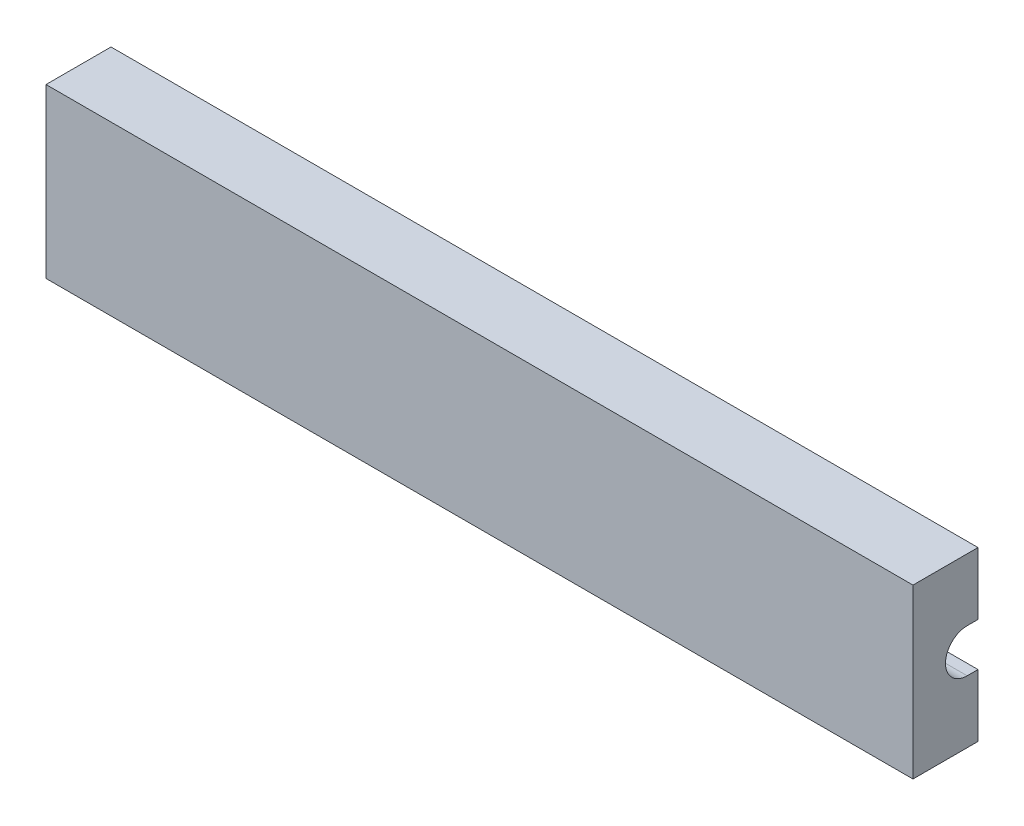
ISO-10303-21;
HEADER;
FILE_DESCRIPTION(('STEP AP214'),'2;1');
FILE_NAME('part.step','',(''),(''),'','','');
FILE_SCHEMA(('AUTOMOTIVE_DESIGN { 1 0 10303 214 1 1 1 1 }'));
ENDSEC;
DATA;
#1=APPLICATION_CONTEXT('core data for automotive mechanical design processes');
#2=APPLICATION_PROTOCOL_DEFINITION('international standard','automotive_design',2000,#1);
#3=PRODUCT_CONTEXT('',#1,'mechanical');
#4=PRODUCT('Part','Part','',(#3));
#5=PRODUCT_RELATED_PRODUCT_CATEGORY('part','',(#4));
#6=PRODUCT_DEFINITION_FORMATION('','',#4);
#7=PRODUCT_DEFINITION_CONTEXT('part definition',#1,'design');
#8=PRODUCT_DEFINITION('design','',#6,#7);
#9=PRODUCT_DEFINITION_SHAPE('','',#8);
#10=(LENGTH_UNIT() NAMED_UNIT(*) SI_UNIT(.MILLI.,.METRE.));
#11=(NAMED_UNIT(*) PLANE_ANGLE_UNIT() SI_UNIT($,.RADIAN.));
#12=(NAMED_UNIT(*) SI_UNIT($,.STERADIAN.) SOLID_ANGLE_UNIT());
#13=UNCERTAINTY_MEASURE_WITH_UNIT(LENGTH_MEASURE(1.E-05),#10,'distance_accuracy_value','');
#14=(GEOMETRIC_REPRESENTATION_CONTEXT(3) GLOBAL_UNCERTAINTY_ASSIGNED_CONTEXT((#13)) GLOBAL_UNIT_ASSIGNED_CONTEXT((#10,
#11,#12)) REPRESENTATION_CONTEXT('',''));
#15=CARTESIAN_POINT('',(0.,0.,0.));
#16=DIRECTION('',(0.,0.,1.));
#17=DIRECTION('',(1.,0.,0.));
#18=AXIS2_PLACEMENT_3D('',#15,#16,#17);
#19=CARTESIAN_POINT('',(250.645147999783,181.413538158492,241.970904960978));
#20=DIRECTION('',(-1.,0.,0.));
#21=DIRECTION('',(0.,0.,1.));
#22=AXIS2_PLACEMENT_3D('',#19,#20,#21);
#23=CYLINDRICAL_SURFACE('',#22,2.);
#24=DIRECTION('',(-1.,0.,0.));
#25=VECTOR('',#24,1.);
#26=CARTESIAN_POINT('',(250.645147999783,179.413538158492,241.970904960978));
#27=LINE('',#26,#25);
#28=CARTESIAN_POINT('',(250.645147999783,179.413538158492,241.970904960978));
#29=VERTEX_POINT('',#28);
#30=CARTESIAN_POINT('',(170.645147999783,179.413538158492,241.970904960978));
#31=VERTEX_POINT('',#30);
#32=EDGE_CURVE('E49',#29,#31,#27,.T.);
#33=ORIENTED_EDGE('',*,*,#32,.T.);
#34=CARTESIAN_POINT('',(170.645147999783,181.413538158492,241.970904960978));
#35=DIRECTION('',(1.,0.,0.));
#36=DIRECTION('',(0.,0.,-1.));
#37=AXIS2_PLACEMENT_3D('',#34,#35,#36);
#38=CIRCLE('',#37,2.);
#39=CARTESIAN_POINT('',(170.645147999783,183.413538158492,241.970904960978));
#40=VERTEX_POINT('',#39);
#41=EDGE_CURVE('E109',#40,#31,#38,.T.);
#42=ORIENTED_EDGE('',*,*,#41,.F.);
#43=DIRECTION('',(-1.,0.,0.));
#44=VECTOR('',#43,1.);
#45=CARTESIAN_POINT('',(250.645147999783,183.413538158492,241.970904960978));
#46=LINE('',#45,#44);
#47=CARTESIAN_POINT('',(250.645147999783,183.413538158492,241.970904960978));
#48=VERTEX_POINT('',#47);
#49=EDGE_CURVE('E11',#48,#40,#46,.T.);
#50=ORIENTED_EDGE('',*,*,#49,.F.);
#51=CARTESIAN_POINT('',(250.645147999783,181.413538158492,241.970904960978));
#52=DIRECTION('',(1.,0.,0.));
#53=DIRECTION('',(0.,0.,-1.));
#54=AXIS2_PLACEMENT_3D('',#51,#52,#53);
#55=CIRCLE('',#54,2.);
#56=EDGE_CURVE('E134',#48,#29,#55,.T.);
#57=ORIENTED_EDGE('',*,*,#56,.T.);
#58=EDGE_LOOP('',(#33,#42,#50,#57));
#59=FACE_BOUND('',#58,.T.);
#60=ADVANCED_FACE('F35',(#59),#23,.F.);
#61=CARTESIAN_POINT('',(250.645147999783,183.413538158492,0.));
#62=DIRECTION('',(0.,1.,0.));
#63=DIRECTION('',(0.,0.,1.));
#64=AXIS2_PLACEMENT_3D('',#61,#62,#63);
#65=PLANE('',#64);
#66=ORIENTED_EDGE('',*,*,#49,.T.);
#67=DIRECTION('',(0.,0.,-1.));
#68=VECTOR('',#67,1.);
#69=CARTESIAN_POINT('',(170.645147999783,183.413538158492,0.));
#70=LINE('',#69,#68);
#71=CARTESIAN_POINT('',(170.645147999783,183.413538158492,240.970904960978));
#72=VERTEX_POINT('',#71);
#73=EDGE_CURVE('E104',#40,#72,#70,.T.);
#74=ORIENTED_EDGE('',*,*,#73,.T.);
#75=DIRECTION('',(-1.,0.,0.));
#76=VECTOR('',#75,1.);
#77=CARTESIAN_POINT('',(250.645147999783,183.413538158492,240.970904960978));
#78=LINE('',#77,#76);
#79=CARTESIAN_POINT('',(250.645147999783,183.413538158492,240.970904960978));
#80=VERTEX_POINT('',#79);
#81=EDGE_CURVE('E42',#80,#72,#78,.T.);
#82=ORIENTED_EDGE('',*,*,#81,.F.);
#83=DIRECTION('',(0.,0.,-1.));
#84=VECTOR('',#83,1.);
#85=CARTESIAN_POINT('',(250.645147999783,183.413538158492,0.));
#86=LINE('',#85,#84);
#87=EDGE_CURVE('E105',#48,#80,#86,.T.);
#88=ORIENTED_EDGE('',*,*,#87,.F.);
#89=EDGE_LOOP('',(#66,#74,#82,#88));
#90=FACE_BOUND('',#89,.T.);
#91=ADVANCED_FACE('F101',(#90),#65,.F.);
#92=CARTESIAN_POINT('',(250.645147999783,0.,240.970904960978));
#93=DIRECTION('',(0.,0.,-1.));
#94=DIRECTION('',(-1.,0.,0.));
#95=AXIS2_PLACEMENT_3D('',#92,#93,#94);
#96=PLANE('',#95);
#97=ORIENTED_EDGE('',*,*,#81,.T.);
#98=DIRECTION('',(0.,-1.,0.));
#99=VECTOR('',#98,1.);
#100=CARTESIAN_POINT('',(170.645147999783,0.,240.970904960978));
#101=LINE('',#100,#99);
#102=CARTESIAN_POINT('',(170.645147999783,189.1635381585,240.970904960978));
#103=VERTEX_POINT('',#102);
#104=EDGE_CURVE('E117',#103,#72,#101,.T.);
#105=ORIENTED_EDGE('',*,*,#104,.F.);
#106=DIRECTION('',(-1.,0.,0.));
#107=VECTOR('',#106,1.);
#108=CARTESIAN_POINT('',(250.645147999783,189.1635381585,240.970904960978));
#109=LINE('',#108,#107);
#110=CARTESIAN_POINT('',(250.645147999783,189.1635381585,240.970904960978));
#111=VERTEX_POINT('',#110);
#112=EDGE_CURVE('E161',#111,#103,#109,.T.);
#113=ORIENTED_EDGE('',*,*,#112,.F.);
#114=DIRECTION('',(0.,-1.,0.));
#115=VECTOR('',#114,1.);
#116=CARTESIAN_POINT('',(250.645147999783,0.,240.970904960978));
#117=LINE('',#116,#115);
#118=EDGE_CURVE('E137',#111,#80,#117,.T.);
#119=ORIENTED_EDGE('',*,*,#118,.T.);
#120=EDGE_LOOP('',(#97,#105,#113,#119));
#121=FACE_BOUND('',#120,.T.);
#122=ADVANCED_FACE('F163',(#121),#96,.T.);
#123=CARTESIAN_POINT('',(250.645147999783,189.1635381585,0.));
#124=DIRECTION('',(0.,1.,0.));
#125=DIRECTION('',(0.,0.,1.));
#126=AXIS2_PLACEMENT_3D('',#123,#124,#125);
#127=PLANE('',#126);
#128=ORIENTED_EDGE('',*,*,#112,.T.);
#129=DIRECTION('',(0.,0.,-1.));
#130=VECTOR('',#129,1.);
#131=CARTESIAN_POINT('',(170.645147999783,189.1635381585,0.));
#132=LINE('',#131,#130);
#133=CARTESIAN_POINT('',(170.645147999783,189.1635381585,246.970904960978));
#134=VERTEX_POINT('',#133);
#135=EDGE_CURVE('E119',#134,#103,#132,.T.);
#136=ORIENTED_EDGE('',*,*,#135,.F.);
#137=DIRECTION('',(-1.,0.,0.));
#138=VECTOR('',#137,1.);
#139=CARTESIAN_POINT('',(250.645147999783,189.1635381585,246.970904960978));
#140=LINE('',#139,#138);
#141=CARTESIAN_POINT('',(250.645147999783,189.1635381585,246.970904960978));
#142=VERTEX_POINT('',#141);
#143=EDGE_CURVE('E159',#142,#134,#140,.T.);
#144=ORIENTED_EDGE('',*,*,#143,.F.);
#145=DIRECTION('',(0.,0.,-1.));
#146=VECTOR('',#145,1.);
#147=CARTESIAN_POINT('',(250.645147999783,189.1635381585,0.));
#148=LINE('',#147,#146);
#149=EDGE_CURVE('E140',#142,#111,#148,.T.);
#150=ORIENTED_EDGE('',*,*,#149,.T.);
#151=EDGE_LOOP('',(#128,#136,#144,#150));
#152=FACE_BOUND('',#151,.T.);
#153=ADVANCED_FACE('F170',(#152),#127,.T.);
#154=CARTESIAN_POINT('',(250.645147999783,0.,246.970904960978));
#155=DIRECTION('',(0.,0.,1.));
#156=DIRECTION('',(1.,0.,0.));
#157=AXIS2_PLACEMENT_3D('',#154,#155,#156);
#158=PLANE('',#157);
#159=ORIENTED_EDGE('',*,*,#143,.T.);
#160=DIRECTION('',(0.,1.,0.));
#161=VECTOR('',#160,1.);
#162=CARTESIAN_POINT('',(170.645147999783,0.,246.970904960978));
#163=LINE('',#162,#161);
#164=CARTESIAN_POINT('',(170.645147999783,173.663538158483,246.970904960978));
#165=VERTEX_POINT('',#164);
#166=EDGE_CURVE('E123',#165,#134,#163,.T.);
#167=ORIENTED_EDGE('',*,*,#166,.F.);
#168=DIRECTION('',(-1.,0.,0.));
#169=VECTOR('',#168,1.);
#170=CARTESIAN_POINT('',(250.645147999783,173.663538158483,246.970904960978));
#171=LINE('',#170,#169);
#172=CARTESIAN_POINT('',(250.645147999783,173.663538158483,246.970904960978));
#173=VERTEX_POINT('',#172);
#174=EDGE_CURVE('E157',#173,#165,#171,.T.);
#175=ORIENTED_EDGE('',*,*,#174,.F.);
#176=DIRECTION('',(0.,1.,0.));
#177=VECTOR('',#176,1.);
#178=CARTESIAN_POINT('',(250.645147999783,0.,246.970904960978));
#179=LINE('',#178,#177);
#180=EDGE_CURVE('E143',#173,#142,#179,.T.);
#181=ORIENTED_EDGE('',*,*,#180,.T.);
#182=EDGE_LOOP('',(#159,#167,#175,#181));
#183=FACE_BOUND('',#182,.T.);
#184=ADVANCED_FACE('F174',(#183),#158,.T.);
#185=CARTESIAN_POINT('',(250.645147999783,173.663538158483,0.));
#186=DIRECTION('',(0.,-1.,0.));
#187=DIRECTION('',(0.,0.,-1.));
#188=AXIS2_PLACEMENT_3D('',#185,#186,#187);
#189=PLANE('',#188);
#190=ORIENTED_EDGE('',*,*,#174,.T.);
#191=DIRECTION('',(0.,0.,1.));
#192=VECTOR('',#191,1.);
#193=CARTESIAN_POINT('',(170.645147999783,173.663538158483,0.));
#194=LINE('',#193,#192);
#195=CARTESIAN_POINT('',(170.645147999783,173.663538158483,240.970904960978));
#196=VERTEX_POINT('',#195);
#197=EDGE_CURVE('E126',#196,#165,#194,.T.);
#198=ORIENTED_EDGE('',*,*,#197,.F.);
#199=DIRECTION('',(-1.,0.,0.));
#200=VECTOR('',#199,1.);
#201=CARTESIAN_POINT('',(250.645147999783,173.663538158483,240.970904960978));
#202=LINE('',#201,#200);
#203=CARTESIAN_POINT('',(250.645147999783,173.663538158483,240.970904960978));
#204=VERTEX_POINT('',#203);
#205=EDGE_CURVE('E155',#204,#196,#202,.T.);
#206=ORIENTED_EDGE('',*,*,#205,.F.);
#207=DIRECTION('',(0.,0.,1.));
#208=VECTOR('',#207,1.);
#209=CARTESIAN_POINT('',(250.645147999783,173.663538158483,0.));
#210=LINE('',#209,#208);
#211=EDGE_CURVE('E146',#204,#173,#210,.T.);
#212=ORIENTED_EDGE('',*,*,#211,.T.);
#213=EDGE_LOOP('',(#190,#198,#206,#212));
#214=FACE_BOUND('',#213,.T.);
#215=ADVANCED_FACE('F177',(#214),#189,.T.);
#216=CARTESIAN_POINT('',(250.645147999783,0.,240.970904960978));
#217=DIRECTION('',(0.,0.,-1.));
#218=DIRECTION('',(-1.,0.,0.));
#219=AXIS2_PLACEMENT_3D('',#216,#217,#218);
#220=PLANE('',#219);
#221=ORIENTED_EDGE('',*,*,#205,.T.);
#222=DIRECTION('',(0.,-1.,0.));
#223=VECTOR('',#222,1.);
#224=CARTESIAN_POINT('',(170.645147999783,0.,240.970904960978));
#225=LINE('',#224,#223);
#226=CARTESIAN_POINT('',(170.645147999783,179.413538158492,240.970904960978));
#227=VERTEX_POINT('',#226);
#228=EDGE_CURVE('E129',#227,#196,#225,.T.);
#229=ORIENTED_EDGE('',*,*,#228,.F.);
#230=DIRECTION('',(-1.,0.,0.));
#231=VECTOR('',#230,1.);
#232=CARTESIAN_POINT('',(250.645147999783,179.413538158492,240.970904960978));
#233=LINE('',#232,#231);
#234=CARTESIAN_POINT('',(250.645147999783,179.413538158492,240.970904960978));
#235=VERTEX_POINT('',#234);
#236=EDGE_CURVE('E57',#235,#227,#233,.T.);
#237=ORIENTED_EDGE('',*,*,#236,.F.);
#238=DIRECTION('',(0.,-1.,0.));
#239=VECTOR('',#238,1.);
#240=CARTESIAN_POINT('',(250.645147999783,0.,240.970904960978));
#241=LINE('',#240,#239);
#242=EDGE_CURVE('E149',#235,#204,#241,.T.);
#243=ORIENTED_EDGE('',*,*,#242,.T.);
#244=EDGE_LOOP('',(#221,#229,#237,#243));
#245=FACE_BOUND('',#244,.T.);
#246=ADVANCED_FACE('F180',(#245),#220,.T.);
#247=CARTESIAN_POINT('',(250.645147999783,179.413538158492,0.));
#248=DIRECTION('',(0.,1.,0.));
#249=DIRECTION('',(0.,0.,1.));
#250=AXIS2_PLACEMENT_3D('',#247,#248,#249);
#251=PLANE('',#250);
#252=ORIENTED_EDGE('',*,*,#236,.T.);
#253=DIRECTION('',(0.,0.,-1.));
#254=VECTOR('',#253,1.);
#255=CARTESIAN_POINT('',(170.645147999783,179.413538158492,0.));
#256=LINE('',#255,#254);
#257=EDGE_CURVE('E132',#31,#227,#256,.T.);
#258=ORIENTED_EDGE('',*,*,#257,.F.);
#259=ORIENTED_EDGE('',*,*,#32,.F.);
#260=DIRECTION('',(0.,0.,-1.));
#261=VECTOR('',#260,1.);
#262=CARTESIAN_POINT('',(250.645147999783,179.413538158492,0.));
#263=LINE('',#262,#261);
#264=EDGE_CURVE('E151',#29,#235,#263,.T.);
#265=ORIENTED_EDGE('',*,*,#264,.T.);
#266=EDGE_LOOP('',(#252,#258,#259,#265));
#267=FACE_BOUND('',#266,.T.);
#268=ADVANCED_FACE('F182',(#267),#251,.T.);
#269=CARTESIAN_POINT('',(250.645147999783,0.,0.));
#270=DIRECTION('',(1.,0.,0.));
#271=DIRECTION('',(0.,0.,-1.));
#272=AXIS2_PLACEMENT_3D('',#269,#270,#271);
#273=PLANE('',#272);
#274=ORIENTED_EDGE('',*,*,#56,.F.);
#275=ORIENTED_EDGE('',*,*,#87,.T.);
#276=ORIENTED_EDGE('',*,*,#118,.F.);
#277=ORIENTED_EDGE('',*,*,#149,.F.);
#278=ORIENTED_EDGE('',*,*,#180,.F.);
#279=ORIENTED_EDGE('',*,*,#211,.F.);
#280=ORIENTED_EDGE('',*,*,#242,.F.);
#281=ORIENTED_EDGE('',*,*,#264,.F.);
#282=EDGE_LOOP('',(#274,#275,#276,#277,#278,#279,#280,#281));
#283=FACE_BOUND('',#282,.T.);
#284=ADVANCED_FACE('F167',(#283),#273,.T.);
#285=CARTESIAN_POINT('',(170.645147999783,0.,0.));
#286=DIRECTION('',(1.,0.,0.));
#287=DIRECTION('',(0.,0.,-1.));
#288=AXIS2_PLACEMENT_3D('',#285,#286,#287);
#289=PLANE('',#288);
#290=ORIENTED_EDGE('',*,*,#41,.T.);
#291=ORIENTED_EDGE('',*,*,#257,.T.);
#292=ORIENTED_EDGE('',*,*,#228,.T.);
#293=ORIENTED_EDGE('',*,*,#197,.T.);
#294=ORIENTED_EDGE('',*,*,#166,.T.);
#295=ORIENTED_EDGE('',*,*,#135,.T.);
#296=ORIENTED_EDGE('',*,*,#104,.T.);
#297=ORIENTED_EDGE('',*,*,#73,.F.);
#298=EDGE_LOOP('',(#290,#291,#292,#293,#294,#295,#296,#297));
#299=FACE_BOUND('',#298,.T.);
#300=ADVANCED_FACE('F114',(#299),#289,.F.);
#301=CLOSED_SHELL('',(#60,#91,#122,#153,#184,#215,#246,#268,#284,#300));
#302=MANIFOLD_SOLID_BREP('B2',#301);
#303=ADVANCED_BREP_SHAPE_REPRESENTATION('',(#18,#302),#14);
#304=SHAPE_DEFINITION_REPRESENTATION(#9,#303);
ENDSEC;
END-ISO-10303-21;
